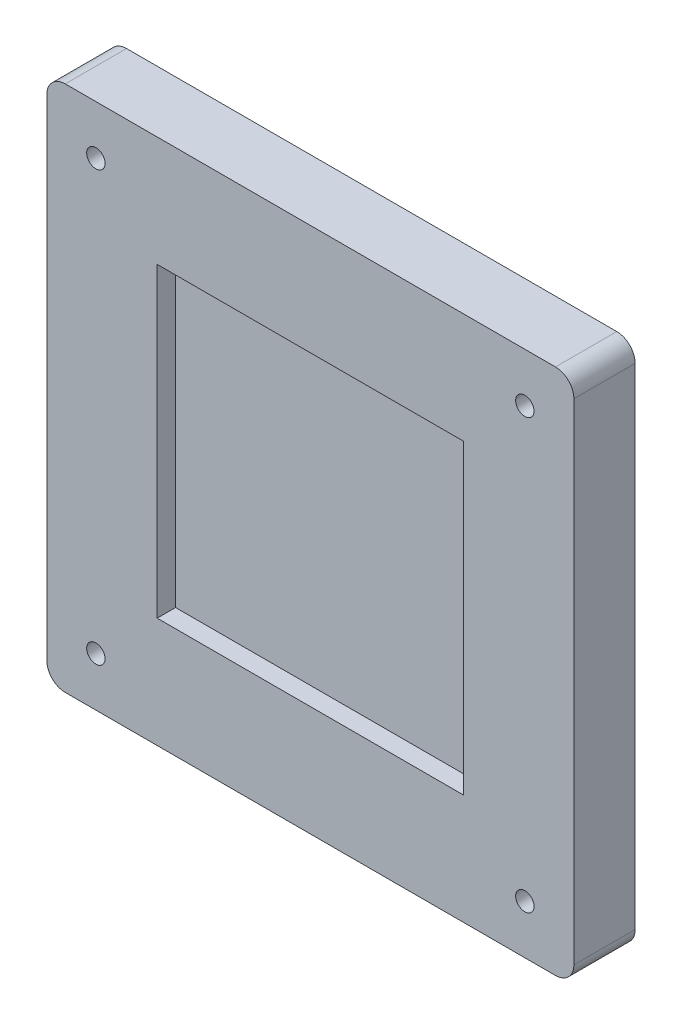
ISO-10303-21;
HEADER;
FILE_DESCRIPTION(('STEP AP214'),'2;1');
FILE_NAME('part.step','',(''),(''),'','','');
FILE_SCHEMA(('AUTOMOTIVE_DESIGN { 1 0 10303 214 1 1 1 1 }'));
ENDSEC;
DATA;
#1=APPLICATION_CONTEXT('core data for automotive mechanical design processes');
#2=APPLICATION_PROTOCOL_DEFINITION('international standard','automotive_design',2000,#1);
#3=PRODUCT_CONTEXT('',#1,'mechanical');
#4=PRODUCT('Part','Part','',(#3));
#5=PRODUCT_RELATED_PRODUCT_CATEGORY('part','',(#4));
#6=PRODUCT_DEFINITION_FORMATION('','',#4);
#7=PRODUCT_DEFINITION_CONTEXT('part definition',#1,'design');
#8=PRODUCT_DEFINITION('design','',#6,#7);
#9=PRODUCT_DEFINITION_SHAPE('','',#8);
#10=(LENGTH_UNIT() NAMED_UNIT(*) SI_UNIT(.MILLI.,.METRE.));
#11=(NAMED_UNIT(*) PLANE_ANGLE_UNIT() SI_UNIT($,.RADIAN.));
#12=(NAMED_UNIT(*) SI_UNIT($,.STERADIAN.) SOLID_ANGLE_UNIT());
#13=UNCERTAINTY_MEASURE_WITH_UNIT(LENGTH_MEASURE(1.E-05),#10,'distance_accuracy_value','');
#14=(GEOMETRIC_REPRESENTATION_CONTEXT(3) GLOBAL_UNCERTAINTY_ASSIGNED_CONTEXT((#13)) GLOBAL_UNIT_ASSIGNED_CONTEXT((#10,
#11,#12)) REPRESENTATION_CONTEXT('',''));
#15=CARTESIAN_POINT('',(0.,0.,0.));
#16=DIRECTION('',(0.,0.,1.));
#17=DIRECTION('',(1.,0.,0.));
#18=AXIS2_PLACEMENT_3D('',#15,#16,#17);
#19=CARTESIAN_POINT('',(-40.,-40.,10.));
#20=DIRECTION('',(0.,0.,-1.));
#21=DIRECTION('',(-1.,0.,0.));
#22=AXIS2_PLACEMENT_3D('',#19,#20,#21);
#23=CYLINDRICAL_SURFACE('',#22,2.99999999999998);
#24=CARTESIAN_POINT('',(-40.,-40.,0.));
#25=DIRECTION('',(0.,0.,1.));
#26=DIRECTION('',(1.,0.,0.));
#27=AXIS2_PLACEMENT_3D('',#24,#25,#26);
#28=CIRCLE('',#27,2.99999999999998);
#29=CARTESIAN_POINT('',(-43.,-40.,0.));
#30=VERTEX_POINT('',#29);
#31=CARTESIAN_POINT('',(-40.,-43.,0.));
#32=VERTEX_POINT('',#31);
#33=EDGE_CURVE('E168',#30,#32,#28,.T.);
#34=ORIENTED_EDGE('',*,*,#33,.T.);
#35=DIRECTION('',(0.,0.,-1.));
#36=VECTOR('',#35,1.);
#37=CARTESIAN_POINT('',(-40.,-43.,10.));
#38=LINE('',#37,#36);
#39=CARTESIAN_POINT('',(-40.,-43.,10.));
#40=VERTEX_POINT('',#39);
#41=EDGE_CURVE('E11',#40,#32,#38,.T.);
#42=ORIENTED_EDGE('',*,*,#41,.F.);
#43=CARTESIAN_POINT('',(-40.,-40.,10.));
#44=DIRECTION('',(0.,0.,1.));
#45=DIRECTION('',(1.,0.,0.));
#46=AXIS2_PLACEMENT_3D('',#43,#44,#45);
#47=CIRCLE('',#46,2.99999999999998);
#48=CARTESIAN_POINT('',(-43.,-40.,10.));
#49=VERTEX_POINT('',#48);
#50=EDGE_CURVE('E192',#49,#40,#47,.T.);
#51=ORIENTED_EDGE('',*,*,#50,.F.);
#52=DIRECTION('',(0.,0.,-1.));
#53=VECTOR('',#52,1.);
#54=CARTESIAN_POINT('',(-43.,-40.,10.));
#55=LINE('',#54,#53);
#56=EDGE_CURVE('E164',#49,#30,#55,.T.);
#57=ORIENTED_EDGE('',*,*,#56,.T.);
#58=EDGE_LOOP('',(#34,#42,#51,#57));
#59=FACE_BOUND('',#58,.T.);
#60=ADVANCED_FACE('F51',(#59),#23,.T.);
#61=CARTESIAN_POINT('',(-40.,-43.,10.));
#62=DIRECTION('',(0.,1.,0.));
#63=DIRECTION('',(0.,0.,1.));
#64=AXIS2_PLACEMENT_3D('',#61,#62,#63);
#65=PLANE('',#64);
#66=DIRECTION('',(1.,0.,0.));
#67=VECTOR('',#66,1.);
#68=CARTESIAN_POINT('',(-40.,-43.,0.));
#69=LINE('',#68,#67);
#70=CARTESIAN_POINT('',(40.,-43.,0.));
#71=VERTEX_POINT('',#70);
#72=EDGE_CURVE('E172',#32,#71,#69,.T.);
#73=ORIENTED_EDGE('',*,*,#72,.T.);
#74=DIRECTION('',(0.,0.,-1.));
#75=VECTOR('',#74,1.);
#76=CARTESIAN_POINT('',(40.,-43.,10.));
#77=LINE('',#76,#75);
#78=CARTESIAN_POINT('',(40.,-43.,10.));
#79=VERTEX_POINT('',#78);
#80=EDGE_CURVE('E61',#79,#71,#77,.T.);
#81=ORIENTED_EDGE('',*,*,#80,.F.);
#82=DIRECTION('',(1.,0.,0.));
#83=VECTOR('',#82,1.);
#84=CARTESIAN_POINT('',(-40.,-43.,10.));
#85=LINE('',#84,#83);
#86=EDGE_CURVE('E119',#40,#79,#85,.T.);
#87=ORIENTED_EDGE('',*,*,#86,.F.);
#88=ORIENTED_EDGE('',*,*,#41,.T.);
#89=EDGE_LOOP('',(#73,#81,#87,#88));
#90=FACE_BOUND('',#89,.T.);
#91=ADVANCED_FACE('F309',(#90),#65,.F.);
#92=CARTESIAN_POINT('',(40.,-40.,10.));
#93=DIRECTION('',(0.,0.,-1.));
#94=DIRECTION('',(-1.,0.,0.));
#95=AXIS2_PLACEMENT_3D('',#92,#93,#94);
#96=CYLINDRICAL_SURFACE('',#95,2.99999999999998);
#97=CARTESIAN_POINT('',(40.,-40.,0.));
#98=DIRECTION('',(0.,0.,1.));
#99=DIRECTION('',(1.,0.,0.));
#100=AXIS2_PLACEMENT_3D('',#97,#98,#99);
#101=CIRCLE('',#100,2.99999999999998);
#102=CARTESIAN_POINT('',(43.,-40.,0.));
#103=VERTEX_POINT('',#102);
#104=EDGE_CURVE('E176',#71,#103,#101,.T.);
#105=ORIENTED_EDGE('',*,*,#104,.T.);
#106=DIRECTION('',(0.,0.,-1.));
#107=VECTOR('',#106,1.);
#108=CARTESIAN_POINT('',(43.,-40.,10.));
#109=LINE('',#108,#107);
#110=CARTESIAN_POINT('',(43.,-40.,10.));
#111=VERTEX_POINT('',#110);
#112=EDGE_CURVE('E203',#111,#103,#109,.T.);
#113=ORIENTED_EDGE('',*,*,#112,.F.);
#114=CARTESIAN_POINT('',(40.,-40.,10.));
#115=DIRECTION('',(0.,0.,1.));
#116=DIRECTION('',(1.,0.,0.));
#117=AXIS2_PLACEMENT_3D('',#114,#115,#116);
#118=CIRCLE('',#117,2.99999999999998);
#119=EDGE_CURVE('E286',#79,#111,#118,.T.);
#120=ORIENTED_EDGE('',*,*,#119,.F.);
#121=ORIENTED_EDGE('',*,*,#80,.T.);
#122=EDGE_LOOP('',(#105,#113,#120,#121));
#123=FACE_BOUND('',#122,.T.);
#124=ADVANCED_FACE('F312',(#123),#96,.T.);
#125=CARTESIAN_POINT('',(43.,-40.,10.));
#126=DIRECTION('',(-1.,0.,0.));
#127=DIRECTION('',(0.,0.,1.));
#128=AXIS2_PLACEMENT_3D('',#125,#126,#127);
#129=PLANE('',#128);
#130=DIRECTION('',(0.,1.,0.));
#131=VECTOR('',#130,1.);
#132=CARTESIAN_POINT('',(43.,-40.,0.));
#133=LINE('',#132,#131);
#134=CARTESIAN_POINT('',(43.,40.,0.));
#135=VERTEX_POINT('',#134);
#136=EDGE_CURVE('E179',#103,#135,#133,.T.);
#137=ORIENTED_EDGE('',*,*,#136,.T.);
#138=DIRECTION('',(0.,0.,-1.));
#139=VECTOR('',#138,1.);
#140=CARTESIAN_POINT('',(43.,40.,10.));
#141=LINE('',#140,#139);
#142=CARTESIAN_POINT('',(43.,40.,10.));
#143=VERTEX_POINT('',#142);
#144=EDGE_CURVE('E199',#143,#135,#141,.T.);
#145=ORIENTED_EDGE('',*,*,#144,.F.);
#146=DIRECTION('',(0.,1.,0.));
#147=VECTOR('',#146,1.);
#148=CARTESIAN_POINT('',(43.,-40.,10.));
#149=LINE('',#148,#147);
#150=EDGE_CURVE('E289',#111,#143,#149,.T.);
#151=ORIENTED_EDGE('',*,*,#150,.F.);
#152=ORIENTED_EDGE('',*,*,#112,.T.);
#153=EDGE_LOOP('',(#137,#145,#151,#152));
#154=FACE_BOUND('',#153,.T.);
#155=ADVANCED_FACE('F297',(#154),#129,.F.);
#156=CARTESIAN_POINT('',(40.,40.,10.));
#157=DIRECTION('',(0.,0.,-1.));
#158=DIRECTION('',(-1.,0.,0.));
#159=AXIS2_PLACEMENT_3D('',#156,#157,#158);
#160=CYLINDRICAL_SURFACE('',#159,2.99999999999998);
#161=CARTESIAN_POINT('',(40.,40.,0.));
#162=DIRECTION('',(0.,0.,1.));
#163=DIRECTION('',(1.,0.,0.));
#164=AXIS2_PLACEMENT_3D('',#161,#162,#163);
#165=CIRCLE('',#164,2.99999999999998);
#166=CARTESIAN_POINT('',(40.,43.,0.));
#167=VERTEX_POINT('',#166);
#168=EDGE_CURVE('E182',#135,#167,#165,.T.);
#169=ORIENTED_EDGE('',*,*,#168,.T.);
#170=DIRECTION('',(0.,0.,-1.));
#171=VECTOR('',#170,1.);
#172=CARTESIAN_POINT('',(40.,43.,10.));
#173=LINE('',#172,#171);
#174=CARTESIAN_POINT('',(40.,43.,10.));
#175=VERTEX_POINT('',#174);
#176=EDGE_CURVE('E156',#175,#167,#173,.T.);
#177=ORIENTED_EDGE('',*,*,#176,.F.);
#178=CARTESIAN_POINT('',(40.,40.,10.));
#179=DIRECTION('',(0.,0.,1.));
#180=DIRECTION('',(1.,0.,0.));
#181=AXIS2_PLACEMENT_3D('',#178,#179,#180);
#182=CIRCLE('',#181,2.99999999999998);
#183=EDGE_CURVE('E142',#143,#175,#182,.T.);
#184=ORIENTED_EDGE('',*,*,#183,.F.);
#185=ORIENTED_EDGE('',*,*,#144,.T.);
#186=EDGE_LOOP('',(#169,#177,#184,#185));
#187=FACE_BOUND('',#186,.T.);
#188=ADVANCED_FACE('F301',(#187),#160,.T.);
#189=CARTESIAN_POINT('',(40.,43.,10.));
#190=DIRECTION('',(0.,-1.,0.));
#191=DIRECTION('',(0.,0.,-1.));
#192=AXIS2_PLACEMENT_3D('',#189,#190,#191);
#193=PLANE('',#192);
#194=DIRECTION('',(-1.,0.,0.));
#195=VECTOR('',#194,1.);
#196=CARTESIAN_POINT('',(40.,43.,0.));
#197=LINE('',#196,#195);
#198=CARTESIAN_POINT('',(-40.,43.,0.));
#199=VERTEX_POINT('',#198);
#200=EDGE_CURVE('E152',#167,#199,#197,.T.);
#201=ORIENTED_EDGE('',*,*,#200,.T.);
#202=DIRECTION('',(0.,0.,-1.));
#203=VECTOR('',#202,1.);
#204=CARTESIAN_POINT('',(-40.,43.,10.));
#205=LINE('',#204,#203);
#206=CARTESIAN_POINT('',(-40.,43.,10.));
#207=VERTEX_POINT('',#206);
#208=EDGE_CURVE('E149',#207,#199,#205,.T.);
#209=ORIENTED_EDGE('',*,*,#208,.F.);
#210=DIRECTION('',(-1.,0.,0.));
#211=VECTOR('',#210,1.);
#212=CARTESIAN_POINT('',(40.,43.,10.));
#213=LINE('',#212,#211);
#214=EDGE_CURVE('E135',#175,#207,#213,.T.);
#215=ORIENTED_EDGE('',*,*,#214,.F.);
#216=ORIENTED_EDGE('',*,*,#176,.T.);
#217=EDGE_LOOP('',(#201,#209,#215,#216));
#218=FACE_BOUND('',#217,.T.);
#219=ADVANCED_FACE('F150',(#218),#193,.F.);
#220=CARTESIAN_POINT('',(-40.,40.,10.));
#221=DIRECTION('',(0.,0.,-1.));
#222=DIRECTION('',(-1.,0.,0.));
#223=AXIS2_PLACEMENT_3D('',#220,#221,#222);
#224=CYLINDRICAL_SURFACE('',#223,2.99999999999998);
#225=CARTESIAN_POINT('',(-40.,40.,0.));
#226=DIRECTION('',(0.,0.,1.));
#227=DIRECTION('',(1.,0.,0.));
#228=AXIS2_PLACEMENT_3D('',#225,#226,#227);
#229=CIRCLE('',#228,2.99999999999998);
#230=CARTESIAN_POINT('',(-43.,40.,0.));
#231=VERTEX_POINT('',#230);
#232=EDGE_CURVE('E187',#199,#231,#229,.T.);
#233=ORIENTED_EDGE('',*,*,#232,.T.);
#234=DIRECTION('',(0.,0.,-1.));
#235=VECTOR('',#234,1.);
#236=CARTESIAN_POINT('',(-43.,40.,10.));
#237=LINE('',#236,#235);
#238=CARTESIAN_POINT('',(-43.,40.,10.));
#239=VERTEX_POINT('',#238);
#240=EDGE_CURVE('E157',#239,#231,#237,.T.);
#241=ORIENTED_EDGE('',*,*,#240,.F.);
#242=CARTESIAN_POINT('',(-40.,40.,10.));
#243=DIRECTION('',(0.,0.,1.));
#244=DIRECTION('',(1.,0.,0.));
#245=AXIS2_PLACEMENT_3D('',#242,#243,#244);
#246=CIRCLE('',#245,2.99999999999998);
#247=EDGE_CURVE('E139',#207,#239,#246,.T.);
#248=ORIENTED_EDGE('',*,*,#247,.F.);
#249=ORIENTED_EDGE('',*,*,#208,.T.);
#250=EDGE_LOOP('',(#233,#241,#248,#249));
#251=FACE_BOUND('',#250,.T.);
#252=ADVANCED_FACE('F159',(#251),#224,.T.);
#253=CARTESIAN_POINT('',(-43.,40.,10.));
#254=DIRECTION('',(1.,0.,0.));
#255=DIRECTION('',(0.,0.,-1.));
#256=AXIS2_PLACEMENT_3D('',#253,#254,#255);
#257=PLANE('',#256);
#258=DIRECTION('',(0.,-1.,0.));
#259=VECTOR('',#258,1.);
#260=CARTESIAN_POINT('',(-43.,40.,0.));
#261=LINE('',#260,#259);
#262=EDGE_CURVE('E111',#231,#30,#261,.T.);
#263=ORIENTED_EDGE('',*,*,#262,.T.);
#264=ORIENTED_EDGE('',*,*,#56,.F.);
#265=DIRECTION('',(0.,-1.,0.));
#266=VECTOR('',#265,1.);
#267=CARTESIAN_POINT('',(-43.,40.,10.));
#268=LINE('',#267,#266);
#269=EDGE_CURVE('E78',#239,#49,#268,.T.);
#270=ORIENTED_EDGE('',*,*,#269,.F.);
#271=ORIENTED_EDGE('',*,*,#240,.T.);
#272=EDGE_LOOP('',(#263,#264,#270,#271));
#273=FACE_BOUND('',#272,.T.);
#274=ADVANCED_FACE('F305',(#273),#257,.F.);
#275=CARTESIAN_POINT('',(-40.,-40.,10.));
#276=DIRECTION('',(0.,0.,1.));
#277=DIRECTION('',(1.,0.,0.));
#278=AXIS2_PLACEMENT_3D('',#275,#276,#277);
#279=PLANE('',#278);
#280=CARTESIAN_POINT('',(-35.,35.,9.99999999999999));
#281=DIRECTION('',(0.,0.,1.));
#282=DIRECTION('',(1.,0.,0.));
#283=AXIS2_PLACEMENT_3D('',#280,#281,#282);
#284=CIRCLE('',#283,1.5);
#285=CARTESIAN_POINT('',(-33.5,35.,9.99999999999999));
#286=VERTEX_POINT('',#285);
#287=EDGE_CURVE('E237',#286,#286,#284,.T.);
#288=ORIENTED_EDGE('',*,*,#287,.F.);
#289=EDGE_LOOP('',(#288));
#290=FACE_BOUND('',#289,.T.);
#291=CARTESIAN_POINT('',(35.,-35.,9.99999999999999));
#292=DIRECTION('',(0.,0.,1.));
#293=DIRECTION('',(1.,0.,0.));
#294=AXIS2_PLACEMENT_3D('',#291,#292,#293);
#295=CIRCLE('',#294,1.5);
#296=CARTESIAN_POINT('',(36.5,-35.,9.99999999999999));
#297=VERTEX_POINT('',#296);
#298=EDGE_CURVE('E222',#297,#297,#295,.T.);
#299=ORIENTED_EDGE('',*,*,#298,.F.);
#300=EDGE_LOOP('',(#299));
#301=FACE_BOUND('',#300,.T.);
#302=CARTESIAN_POINT('',(35.,35.,9.99999999999999));
#303=DIRECTION('',(0.,0.,1.));
#304=DIRECTION('',(1.,0.,0.));
#305=AXIS2_PLACEMENT_3D('',#302,#303,#304);
#306=CIRCLE('',#305,1.5);
#307=CARTESIAN_POINT('',(36.5,35.,9.99999999999999));
#308=VERTEX_POINT('',#307);
#309=EDGE_CURVE('E218',#308,#308,#306,.T.);
#310=ORIENTED_EDGE('',*,*,#309,.F.);
#311=EDGE_LOOP('',(#310));
#312=FACE_BOUND('',#311,.T.);
#313=CARTESIAN_POINT('',(-35.,-35.,9.99999999999999));
#314=DIRECTION('',(0.,0.,1.));
#315=DIRECTION('',(1.,0.,0.));
#316=AXIS2_PLACEMENT_3D('',#313,#314,#315);
#317=CIRCLE('',#316,1.5);
#318=CARTESIAN_POINT('',(-33.5,-35.,9.99999999999999));
#319=VERTEX_POINT('',#318);
#320=EDGE_CURVE('E214',#319,#319,#317,.T.);
#321=ORIENTED_EDGE('',*,*,#320,.F.);
#322=EDGE_LOOP('',(#321));
#323=FACE_BOUND('',#322,.T.);
#324=DIRECTION('',(0.,-1.,0.));
#325=VECTOR('',#324,1.);
#326=CARTESIAN_POINT('',(-25.,25.,10.));
#327=LINE('',#326,#325);
#328=CARTESIAN_POINT('',(-25.,25.,10.));
#329=VERTEX_POINT('',#328);
#330=CARTESIAN_POINT('',(-25.,-25.,10.));
#331=VERTEX_POINT('',#330);
#332=EDGE_CURVE('E69',#329,#331,#327,.T.);
#333=ORIENTED_EDGE('',*,*,#332,.F.);
#334=DIRECTION('',(-1.,0.,0.));
#335=VECTOR('',#334,1.);
#336=CARTESIAN_POINT('',(25.,25.,10.));
#337=LINE('',#336,#335);
#338=CARTESIAN_POINT('',(25.,25.,10.));
#339=VERTEX_POINT('',#338);
#340=EDGE_CURVE('E246',#339,#329,#337,.T.);
#341=ORIENTED_EDGE('',*,*,#340,.F.);
#342=DIRECTION('',(0.,1.,0.));
#343=VECTOR('',#342,1.);
#344=CARTESIAN_POINT('',(25.,-25.,10.));
#345=LINE('',#344,#343);
#346=CARTESIAN_POINT('',(25.,-25.,10.));
#347=VERTEX_POINT('',#346);
#348=EDGE_CURVE('E264',#347,#339,#345,.T.);
#349=ORIENTED_EDGE('',*,*,#348,.F.);
#350=DIRECTION('',(1.,0.,0.));
#351=VECTOR('',#350,1.);
#352=CARTESIAN_POINT('',(-25.,-25.,10.));
#353=LINE('',#352,#351);
#354=EDGE_CURVE('E260',#331,#347,#353,.T.);
#355=ORIENTED_EDGE('',*,*,#354,.F.);
#356=EDGE_LOOP('',(#333,#341,#349,#355));
#357=FACE_BOUND('',#356,.T.);
#358=ORIENTED_EDGE('',*,*,#50,.T.);
#359=ORIENTED_EDGE('',*,*,#86,.T.);
#360=ORIENTED_EDGE('',*,*,#119,.T.);
#361=ORIENTED_EDGE('',*,*,#150,.T.);
#362=ORIENTED_EDGE('',*,*,#183,.T.);
#363=ORIENTED_EDGE('',*,*,#214,.T.);
#364=ORIENTED_EDGE('',*,*,#247,.T.);
#365=ORIENTED_EDGE('',*,*,#269,.T.);
#366=EDGE_LOOP('',(#358,#359,#360,#361,#362,#363,#364,#365));
#367=FACE_BOUND('',#366,.T.);
#368=ADVANCED_FACE('F137',(#290,#301,#312,#323,#357,#367),#279,.T.);
#369=CARTESIAN_POINT('',(-40.,-40.,0.));
#370=DIRECTION('',(0.,0.,1.));
#371=DIRECTION('',(1.,0.,0.));
#372=AXIS2_PLACEMENT_3D('',#369,#370,#371);
#373=PLANE('',#372);
#374=CARTESIAN_POINT('',(-35.,35.,0.));
#375=DIRECTION('',(0.,0.,1.));
#376=DIRECTION('',(1.,0.,0.));
#377=AXIS2_PLACEMENT_3D('',#374,#375,#376);
#378=CIRCLE('',#377,1.5);
#379=CARTESIAN_POINT('',(-33.5,35.,0.));
#380=VERTEX_POINT('',#379);
#381=EDGE_CURVE('E55',#380,#380,#378,.T.);
#382=ORIENTED_EDGE('',*,*,#381,.T.);
#383=EDGE_LOOP('',(#382));
#384=FACE_BOUND('',#383,.T.);
#385=CARTESIAN_POINT('',(35.,-35.,0.));
#386=DIRECTION('',(0.,0.,1.));
#387=DIRECTION('',(1.,0.,0.));
#388=AXIS2_PLACEMENT_3D('',#385,#386,#387);
#389=CIRCLE('',#388,1.5);
#390=CARTESIAN_POINT('',(36.5,-35.,0.));
#391=VERTEX_POINT('',#390);
#392=EDGE_CURVE('E219',#391,#391,#389,.T.);
#393=ORIENTED_EDGE('',*,*,#392,.T.);
#394=EDGE_LOOP('',(#393));
#395=FACE_BOUND('',#394,.T.);
#396=CARTESIAN_POINT('',(35.,35.,0.));
#397=DIRECTION('',(0.,0.,1.));
#398=DIRECTION('',(1.,0.,0.));
#399=AXIS2_PLACEMENT_3D('',#396,#397,#398);
#400=CIRCLE('',#399,1.5);
#401=CARTESIAN_POINT('',(36.5,35.,0.));
#402=VERTEX_POINT('',#401);
#403=EDGE_CURVE('E215',#402,#402,#400,.T.);
#404=ORIENTED_EDGE('',*,*,#403,.T.);
#405=EDGE_LOOP('',(#404));
#406=FACE_BOUND('',#405,.T.);
#407=CARTESIAN_POINT('',(-35.,-35.,0.));
#408=DIRECTION('',(0.,0.,1.));
#409=DIRECTION('',(1.,0.,0.));
#410=AXIS2_PLACEMENT_3D('',#407,#408,#409);
#411=CIRCLE('',#410,1.5);
#412=CARTESIAN_POINT('',(-33.5,-35.,0.));
#413=VERTEX_POINT('',#412);
#414=EDGE_CURVE('E210',#413,#413,#411,.T.);
#415=ORIENTED_EDGE('',*,*,#414,.T.);
#416=EDGE_LOOP('',(#415));
#417=FACE_BOUND('',#416,.T.);
#418=ORIENTED_EDGE('',*,*,#33,.F.);
#419=ORIENTED_EDGE('',*,*,#262,.F.);
#420=ORIENTED_EDGE('',*,*,#232,.F.);
#421=ORIENTED_EDGE('',*,*,#200,.F.);
#422=ORIENTED_EDGE('',*,*,#168,.F.);
#423=ORIENTED_EDGE('',*,*,#136,.F.);
#424=ORIENTED_EDGE('',*,*,#104,.F.);
#425=ORIENTED_EDGE('',*,*,#72,.F.);
#426=EDGE_LOOP('',(#418,#419,#420,#421,#422,#423,#424,#425));
#427=FACE_BOUND('',#426,.T.);
#428=ADVANCED_FACE('F304',(#384,#395,#406,#417,#427),#373,.F.);
#429=CARTESIAN_POINT('',(-25.,25.,7.));
#430=DIRECTION('',(-1.,0.,0.));
#431=DIRECTION('',(0.,0.,1.));
#432=AXIS2_PLACEMENT_3D('',#429,#430,#431);
#433=PLANE('',#432);
#434=ORIENTED_EDGE('',*,*,#332,.T.);
#435=DIRECTION('',(0.,0.,1.));
#436=VECTOR('',#435,1.);
#437=CARTESIAN_POINT('',(-25.,-25.,7.));
#438=LINE('',#437,#436);
#439=CARTESIAN_POINT('',(-25.,-25.,7.));
#440=VERTEX_POINT('',#439);
#441=EDGE_CURVE('E257',#440,#331,#438,.T.);
#442=ORIENTED_EDGE('',*,*,#441,.F.);
#443=DIRECTION('',(0.,-1.,0.));
#444=VECTOR('',#443,1.);
#445=CARTESIAN_POINT('',(-25.,25.,7.));
#446=LINE('',#445,#444);
#447=CARTESIAN_POINT('',(-25.,25.,7.));
#448=VERTEX_POINT('',#447);
#449=EDGE_CURVE('E241',#448,#440,#446,.T.);
#450=ORIENTED_EDGE('',*,*,#449,.F.);
#451=DIRECTION('',(0.,0.,1.));
#452=VECTOR('',#451,1.);
#453=CARTESIAN_POINT('',(-25.,25.,7.));
#454=LINE('',#453,#452);
#455=EDGE_CURVE('E173',#448,#329,#454,.T.);
#456=ORIENTED_EDGE('',*,*,#455,.T.);
#457=EDGE_LOOP('',(#434,#442,#450,#456));
#458=FACE_BOUND('',#457,.T.);
#459=ADVANCED_FACE('F371',(#458),#433,.F.);
#460=CARTESIAN_POINT('',(25.,25.,7.));
#461=DIRECTION('',(0.,1.,0.));
#462=DIRECTION('',(0.,0.,1.));
#463=AXIS2_PLACEMENT_3D('',#460,#461,#462);
#464=PLANE('',#463);
#465=ORIENTED_EDGE('',*,*,#340,.T.);
#466=ORIENTED_EDGE('',*,*,#455,.F.);
#467=DIRECTION('',(-1.,0.,0.));
#468=VECTOR('',#467,1.);
#469=CARTESIAN_POINT('',(25.,25.,7.));
#470=LINE('',#469,#468);
#471=CARTESIAN_POINT('',(25.,25.,7.));
#472=VERTEX_POINT('',#471);
#473=EDGE_CURVE('E254',#472,#448,#470,.T.);
#474=ORIENTED_EDGE('',*,*,#473,.F.);
#475=DIRECTION('',(0.,0.,1.));
#476=VECTOR('',#475,1.);
#477=CARTESIAN_POINT('',(25.,25.,7.));
#478=LINE('',#477,#476);
#479=EDGE_CURVE('E273',#472,#339,#478,.T.);
#480=ORIENTED_EDGE('',*,*,#479,.T.);
#481=EDGE_LOOP('',(#465,#466,#474,#480));
#482=FACE_BOUND('',#481,.T.);
#483=ADVANCED_FACE('F379',(#482),#464,.F.);
#484=CARTESIAN_POINT('',(25.,-25.,7.));
#485=DIRECTION('',(1.,0.,0.));
#486=DIRECTION('',(0.,0.,-1.));
#487=AXIS2_PLACEMENT_3D('',#484,#485,#486);
#488=PLANE('',#487);
#489=ORIENTED_EDGE('',*,*,#348,.T.);
#490=ORIENTED_EDGE('',*,*,#479,.F.);
#491=DIRECTION('',(0.,1.,0.));
#492=VECTOR('',#491,1.);
#493=CARTESIAN_POINT('',(25.,-25.,7.));
#494=LINE('',#493,#492);
#495=CARTESIAN_POINT('',(25.,-25.,7.));
#496=VERTEX_POINT('',#495);
#497=EDGE_CURVE('E250',#496,#472,#494,.T.);
#498=ORIENTED_EDGE('',*,*,#497,.F.);
#499=DIRECTION('',(0.,0.,1.));
#500=VECTOR('',#499,1.);
#501=CARTESIAN_POINT('',(25.,-25.,7.));
#502=LINE('',#501,#500);
#503=EDGE_CURVE('E277',#496,#347,#502,.T.);
#504=ORIENTED_EDGE('',*,*,#503,.T.);
#505=EDGE_LOOP('',(#489,#490,#498,#504));
#506=FACE_BOUND('',#505,.T.);
#507=ADVANCED_FACE('F386',(#506),#488,.F.);
#508=CARTESIAN_POINT('',(-25.,-25.,7.));
#509=DIRECTION('',(0.,-1.,0.));
#510=DIRECTION('',(0.,0.,-1.));
#511=AXIS2_PLACEMENT_3D('',#508,#509,#510);
#512=PLANE('',#511);
#513=ORIENTED_EDGE('',*,*,#354,.T.);
#514=ORIENTED_EDGE('',*,*,#503,.F.);
#515=DIRECTION('',(1.,0.,0.));
#516=VECTOR('',#515,1.);
#517=CARTESIAN_POINT('',(-25.,-25.,7.));
#518=LINE('',#517,#516);
#519=EDGE_CURVE('E245',#440,#496,#518,.T.);
#520=ORIENTED_EDGE('',*,*,#519,.F.);
#521=ORIENTED_EDGE('',*,*,#441,.T.);
#522=EDGE_LOOP('',(#513,#514,#520,#521));
#523=FACE_BOUND('',#522,.T.);
#524=ADVANCED_FACE('F394',(#523),#512,.F.);
#525=CARTESIAN_POINT('',(0.,0.,7.));
#526=DIRECTION('',(0.,0.,1.));
#527=DIRECTION('',(1.,0.,0.));
#528=AXIS2_PLACEMENT_3D('',#525,#526,#527);
#529=PLANE('',#528);
#530=ORIENTED_EDGE('',*,*,#449,.T.);
#531=ORIENTED_EDGE('',*,*,#519,.T.);
#532=ORIENTED_EDGE('',*,*,#497,.T.);
#533=ORIENTED_EDGE('',*,*,#473,.T.);
#534=EDGE_LOOP('',(#530,#531,#532,#533));
#535=FACE_BOUND('',#534,.T.);
#536=ADVANCED_FACE('F402',(#535),#529,.T.);
#537=CARTESIAN_POINT('',(-35.,-35.,-77.));
#538=DIRECTION('',(0.,0.,1.));
#539=DIRECTION('',(1.,0.,0.));
#540=AXIS2_PLACEMENT_3D('',#537,#538,#539);
#541=CYLINDRICAL_SURFACE('',#540,1.5);
#542=ORIENTED_EDGE('',*,*,#320,.T.);
#543=EDGE_LOOP('',(#542));
#544=FACE_BOUND('',#543,.T.);
#545=ORIENTED_EDGE('',*,*,#414,.F.);
#546=EDGE_LOOP('',(#545));
#547=FACE_BOUND('',#546,.T.);
#548=ADVANCED_FACE('F409',(#544,#547),#541,.F.);
#549=CARTESIAN_POINT('',(35.,35.,-77.));
#550=DIRECTION('',(0.,0.,1.));
#551=DIRECTION('',(1.,0.,0.));
#552=AXIS2_PLACEMENT_3D('',#549,#550,#551);
#553=CYLINDRICAL_SURFACE('',#552,1.5);
#554=ORIENTED_EDGE('',*,*,#309,.T.);
#555=EDGE_LOOP('',(#554));
#556=FACE_BOUND('',#555,.T.);
#557=ORIENTED_EDGE('',*,*,#403,.F.);
#558=EDGE_LOOP('',(#557));
#559=FACE_BOUND('',#558,.T.);
#560=ADVANCED_FACE('F416',(#556,#559),#553,.F.);
#561=CARTESIAN_POINT('',(35.,-35.,-77.));
#562=DIRECTION('',(0.,0.,1.));
#563=DIRECTION('',(1.,0.,0.));
#564=AXIS2_PLACEMENT_3D('',#561,#562,#563);
#565=CYLINDRICAL_SURFACE('',#564,1.5);
#566=ORIENTED_EDGE('',*,*,#298,.T.);
#567=EDGE_LOOP('',(#566));
#568=FACE_BOUND('',#567,.T.);
#569=ORIENTED_EDGE('',*,*,#392,.F.);
#570=EDGE_LOOP('',(#569));
#571=FACE_BOUND('',#570,.T.);
#572=ADVANCED_FACE('F424',(#568,#571),#565,.F.);
#573=CARTESIAN_POINT('',(-35.,35.,-77.));
#574=DIRECTION('',(0.,0.,1.));
#575=DIRECTION('',(1.,0.,0.));
#576=AXIS2_PLACEMENT_3D('',#573,#574,#575);
#577=CYLINDRICAL_SURFACE('',#576,1.5);
#578=ORIENTED_EDGE('',*,*,#287,.T.);
#579=EDGE_LOOP('',(#578));
#580=FACE_BOUND('',#579,.T.);
#581=ORIENTED_EDGE('',*,*,#381,.F.);
#582=EDGE_LOOP('',(#581));
#583=FACE_BOUND('',#582,.T.);
#584=ADVANCED_FACE('F431',(#580,#583),#577,.F.);
#585=CLOSED_SHELL('',(#60,#91,#124,#155,#188,#219,#252,#274,#368,#428,#459,#483,#507,#524,#536,
#548,#560,#572,#584));
#586=MANIFOLD_SOLID_BREP('B2',#585);
#587=ADVANCED_BREP_SHAPE_REPRESENTATION('',(#18,#586),#14);
#588=SHAPE_DEFINITION_REPRESENTATION(#9,#587);
ENDSEC;
END-ISO-10303-21;
